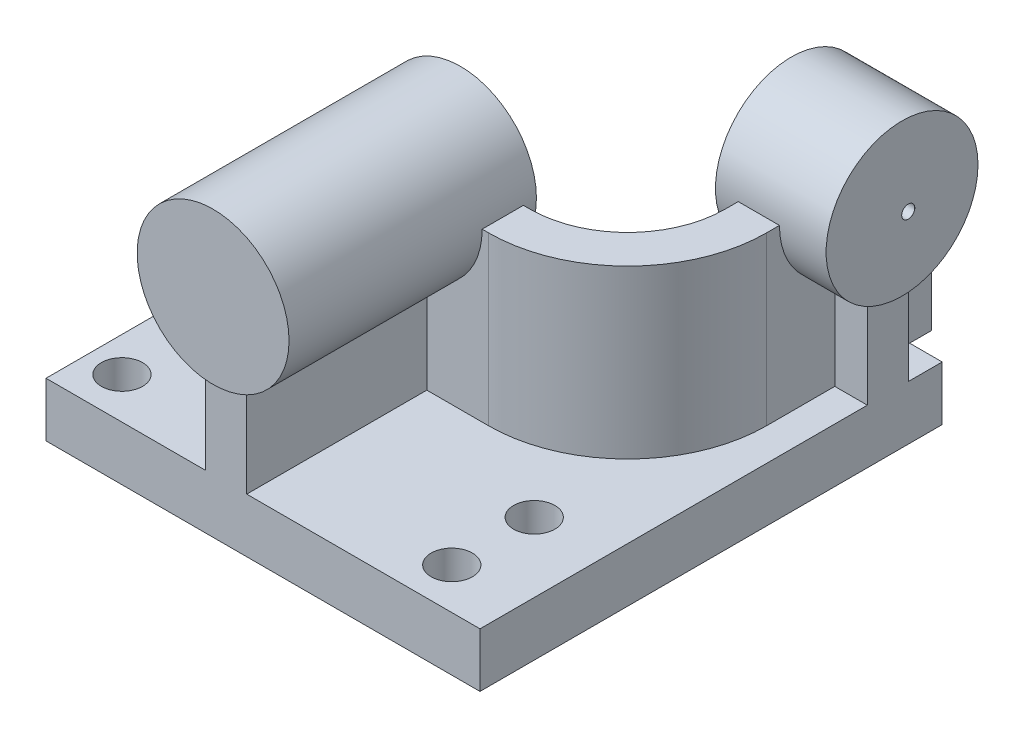
ISO-10303-21;
HEADER;
FILE_DESCRIPTION(('STEP AP214'),'2;1');
FILE_NAME('part.step','',(''),(''),'','','');
FILE_SCHEMA(('AUTOMOTIVE_DESIGN { 1 0 10303 214 1 1 1 1 }'));
ENDSEC;
DATA;
#1=APPLICATION_CONTEXT('core data for automotive mechanical design processes');
#2=APPLICATION_PROTOCOL_DEFINITION('international standard','automotive_design',2000,#1);
#3=PRODUCT_CONTEXT('',#1,'mechanical');
#4=PRODUCT('Part','Part','',(#3));
#5=PRODUCT_RELATED_PRODUCT_CATEGORY('part','',(#4));
#6=PRODUCT_DEFINITION_FORMATION('','',#4);
#7=PRODUCT_DEFINITION_CONTEXT('part definition',#1,'design');
#8=PRODUCT_DEFINITION('design','',#6,#7);
#9=PRODUCT_DEFINITION_SHAPE('','',#8);
#10=(LENGTH_UNIT() NAMED_UNIT(*) SI_UNIT(.MILLI.,.METRE.));
#11=(NAMED_UNIT(*) PLANE_ANGLE_UNIT() SI_UNIT($,.RADIAN.));
#12=(NAMED_UNIT(*) SI_UNIT($,.STERADIAN.) SOLID_ANGLE_UNIT());
#13=UNCERTAINTY_MEASURE_WITH_UNIT(LENGTH_MEASURE(1.E-05),#10,'distance_accuracy_value','');
#14=(GEOMETRIC_REPRESENTATION_CONTEXT(3) GLOBAL_UNCERTAINTY_ASSIGNED_CONTEXT((#13)) GLOBAL_UNIT_ASSIGNED_CONTEXT((#10,
#11,#12)) REPRESENTATION_CONTEXT('',''));
#15=CARTESIAN_POINT('',(0.,0.,0.));
#16=DIRECTION('',(0.,0.,1.));
#17=DIRECTION('',(1.,0.,0.));
#18=AXIS2_PLACEMENT_3D('',#15,#16,#17);
#19=CARTESIAN_POINT('',(121.,25.,-147.));
#20=DIRECTION('',(0.,-1.,0.));
#21=DIRECTION('',(0.,0.,-1.));
#22=AXIS2_PLACEMENT_3D('',#19,#20,#21);
#23=PLANE('',#22);
#24=CARTESIAN_POINT('',(16.,25.,-19.));
#25=DIRECTION('',(0.,1.,0.));
#26=DIRECTION('',(0.,0.,1.));
#27=AXIS2_PLACEMENT_3D('',#24,#25,#26);
#28=CIRCLE('',#27,9.5);
#29=CARTESIAN_POINT('',(16.,25.,-9.50000000000004));
#30=VERTEX_POINT('',#29);
#31=EDGE_CURVE('E334',#30,#30,#28,.T.);
#32=ORIENTED_EDGE('',*,*,#31,.F.);
#33=EDGE_LOOP('',(#32));
#34=FACE_BOUND('',#33,.T.);
#35=CARTESIAN_POINT('',(16.,25.,-57.));
#36=DIRECTION('',(0.,1.,0.));
#37=DIRECTION('',(0.,0.,1.));
#38=AXIS2_PLACEMENT_3D('',#35,#36,#37);
#39=CIRCLE('',#38,9.50000000000001);
#40=CARTESIAN_POINT('',(16.,25.,-47.5));
#41=VERTEX_POINT('',#40);
#42=EDGE_CURVE('E340',#41,#41,#39,.T.);
#43=ORIENTED_EDGE('',*,*,#42,.F.);
#44=EDGE_LOOP('',(#43));
#45=FACE_BOUND('',#44,.T.);
#46=DIRECTION('',(0.,0.,1.));
#47=VECTOR('',#46,1.);
#48=CARTESIAN_POINT('',(73.5,25.,-147.));
#49=LINE('',#48,#47);
#50=CARTESIAN_POINT('',(73.5,25.,-83.));
#51=VERTEX_POINT('',#50);
#52=CARTESIAN_POINT('',(73.5,25.,0.));
#53=VERTEX_POINT('',#52);
#54=EDGE_CURVE('E223',#51,#53,#49,.T.);
#55=ORIENTED_EDGE('',*,*,#54,.F.);
#56=DIRECTION('',(1.,0.,0.));
#57=VECTOR('',#56,1.);
#58=CARTESIAN_POINT('',(121.,25.,-83.));
#59=LINE('',#58,#57);
#60=CARTESIAN_POINT('',(48.,25.,-83.));
#61=VERTEX_POINT('',#60);
#62=EDGE_CURVE('E199',#61,#51,#59,.T.);
#63=ORIENTED_EDGE('',*,*,#62,.F.);
#64=DIRECTION('',(0.,0.,1.));
#65=VECTOR('',#64,1.);
#66=CARTESIAN_POINT('',(48.,25.,-102.));
#67=LINE('',#66,#65);
#68=CARTESIAN_POINT('',(48.,25.,-102.));
#69=VERTEX_POINT('',#68);
#70=EDGE_CURVE('E267',#69,#61,#67,.T.);
#71=ORIENTED_EDGE('',*,*,#70,.F.);
#72=DIRECTION('',(-1.,0.,0.));
#73=VECTOR('',#72,1.);
#74=CARTESIAN_POINT('',(121.,25.,-102.));
#75=LINE('',#74,#73);
#76=CARTESIAN_POINT('',(0.,25.,-102.));
#77=VERTEX_POINT('',#76);
#78=EDGE_CURVE('E346',#69,#77,#75,.T.);
#79=ORIENTED_EDGE('',*,*,#78,.T.);
#80=DIRECTION('',(0.,0.,1.));
#81=VECTOR('',#80,1.);
#82=CARTESIAN_POINT('',(0.,25.,-102.));
#83=LINE('',#82,#81);
#84=CARTESIAN_POINT('',(0.,25.,0.));
#85=VERTEX_POINT('',#84);
#86=EDGE_CURVE('E348',#77,#85,#83,.T.);
#87=ORIENTED_EDGE('',*,*,#86,.T.);
#88=DIRECTION('',(1.,0.,0.));
#89=VECTOR('',#88,1.);
#90=CARTESIAN_POINT('',(0.,25.,0.));
#91=LINE('',#90,#89);
#92=EDGE_CURVE('E352',#85,#53,#91,.T.);
#93=ORIENTED_EDGE('',*,*,#92,.T.);
#94=EDGE_LOOP('',(#55,#63,#71,#79,#87,#93));
#95=FACE_BOUND('',#94,.T.);
#96=ADVANCED_FACE('F33',(#34,#45,#95),#23,.F.);
#97=CARTESIAN_POINT('',(121.,102.,-83.));
#98=DIRECTION('',(0.,0.,-1.));
#99=DIRECTION('',(-1.,0.,0.));
#100=AXIS2_PLACEMENT_3D('',#97,#98,#99);
#101=PLANE('',#100);
#102=CARTESIAN_POINT('',(83.,102.,-83.));
#103=DIRECTION('',(0.,0.,-1.));
#104=DIRECTION('',(-1.,0.,0.));
#105=AXIS2_PLACEMENT_3D('',#102,#103,#104);
#106=CIRCLE('',#105,35.);
#107=CARTESIAN_POINT('',(118.,102.,-83.));
#108=VERTEX_POINT('',#107);
#109=CARTESIAN_POINT('',(92.5,68.313949474597,-83.));
#110=VERTEX_POINT('',#109);
#111=EDGE_CURVE('E216',#108,#110,#106,.T.);
#112=ORIENTED_EDGE('',*,*,#111,.T.);
#113=DIRECTION('',(0.,-1.,0.));
#114=VECTOR('',#113,1.);
#115=CARTESIAN_POINT('',(92.5,102.,-83.));
#116=LINE('',#115,#114);
#117=CARTESIAN_POINT('',(92.5,25.,-83.));
#118=VERTEX_POINT('',#117);
#119=EDGE_CURVE('E11',#110,#118,#116,.T.);
#120=ORIENTED_EDGE('',*,*,#119,.T.);
#121=CARTESIAN_POINT('',(121.,25.,-83.));
#122=VERTEX_POINT('',#121);
#123=EDGE_CURVE('E291',#118,#122,#59,.T.);
#124=ORIENTED_EDGE('',*,*,#123,.T.);
#125=DIRECTION('',(0.,-1.,0.));
#126=VECTOR('',#125,1.);
#127=CARTESIAN_POINT('',(121.,102.,-83.));
#128=LINE('',#127,#126);
#129=CARTESIAN_POINT('',(121.,102.,-83.));
#130=VERTEX_POINT('',#129);
#131=EDGE_CURVE('E313',#130,#122,#128,.T.);
#132=ORIENTED_EDGE('',*,*,#131,.F.);
#133=DIRECTION('',(1.,0.,0.));
#134=VECTOR('',#133,1.);
#135=CARTESIAN_POINT('',(121.,102.,-83.));
#136=LINE('',#135,#134);
#137=EDGE_CURVE('E276',#108,#130,#136,.T.);
#138=ORIENTED_EDGE('',*,*,#137,.F.);
#139=EDGE_LOOP('',(#112,#120,#124,#132,#138));
#140=FACE_BOUND('',#139,.T.);
#141=ADVANCED_FACE('F413',(#140),#101,.F.);
#142=CARTESIAN_POINT('',(168.,25.,-19.));
#143=DIRECTION('',(0.,1.,0.));
#144=DIRECTION('',(0.,0.,1.));
#145=AXIS2_PLACEMENT_3D('',#142,#143,#144);
#146=CIRCLE('',#145,9.49999999999998);
#147=CARTESIAN_POINT('',(168.,25.,-9.50000000000006));
#148=VERTEX_POINT('',#147);
#149=EDGE_CURVE('E328',#148,#148,#146,.T.);
#150=ORIENTED_EDGE('',*,*,#149,.F.);
#151=EDGE_LOOP('',(#150));
#152=FACE_BOUND('',#151,.T.);
#153=CARTESIAN_POINT('',(168.,25.,-57.));
#154=DIRECTION('',(0.,1.,0.));
#155=DIRECTION('',(0.,0.,1.));
#156=AXIS2_PLACEMENT_3D('',#153,#154,#155);
#157=CIRCLE('',#156,9.50000000000001);
#158=CARTESIAN_POINT('',(168.,25.,-47.5));
#159=VERTEX_POINT('',#158);
#160=EDGE_CURVE('E322',#159,#159,#157,.T.);
#161=ORIENTED_EDGE('',*,*,#160,.F.);
#162=EDGE_LOOP('',(#161));
#163=FACE_BOUND('',#162,.T.);
#164=ORIENTED_EDGE('',*,*,#123,.F.);
#165=DIRECTION('',(0.,0.,1.));
#166=VECTOR('',#165,1.);
#167=CARTESIAN_POINT('',(92.5,25.,-147.));
#168=LINE('',#167,#166);
#169=CARTESIAN_POINT('',(92.5,25.,0.));
#170=VERTEX_POINT('',#169);
#171=EDGE_CURVE('E229',#118,#170,#168,.T.);
#172=ORIENTED_EDGE('',*,*,#171,.T.);
#173=CARTESIAN_POINT('',(200.,25.,0.));
#174=VERTEX_POINT('',#173);
#175=EDGE_CURVE('E351',#170,#174,#91,.T.);
#176=ORIENTED_EDGE('',*,*,#175,.T.);
#177=DIRECTION('',(0.,0.,-1.));
#178=VECTOR('',#177,1.);
#179=CARTESIAN_POINT('',(200.,25.,0.));
#180=LINE('',#179,#178);
#181=CARTESIAN_POINT('',(200.,25.,-178.5));
#182=VERTEX_POINT('',#181);
#183=EDGE_CURVE('E355',#174,#182,#180,.T.);
#184=ORIENTED_EDGE('',*,*,#183,.T.);
#185=DIRECTION('',(1.,0.,0.));
#186=VECTOR('',#185,1.);
#187=CARTESIAN_POINT('',(121.,25.,-178.5));
#188=LINE('',#187,#186);
#189=CARTESIAN_POINT('',(185.,25.,-178.5));
#190=VERTEX_POINT('',#189);
#191=EDGE_CURVE('E241',#190,#182,#188,.T.);
#192=ORIENTED_EDGE('',*,*,#191,.F.);
#193=DIRECTION('',(0.,0.,-1.));
#194=VECTOR('',#193,1.);
#195=CARTESIAN_POINT('',(185.,25.,-223.));
#196=LINE('',#195,#194);
#197=CARTESIAN_POINT('',(185.,25.,-147.));
#198=VERTEX_POINT('',#197);
#199=EDGE_CURVE('E297',#198,#190,#196,.T.);
#200=ORIENTED_EDGE('',*,*,#199,.F.);
#201=CARTESIAN_POINT('',(121.,25.,-147.));
#202=DIRECTION('',(0.,1.,0.));
#203=DIRECTION('',(0.,0.,1.));
#204=AXIS2_PLACEMENT_3D('',#201,#202,#203);
#205=CIRCLE('',#204,64.);
#206=EDGE_CURVE('E293',#122,#198,#205,.T.);
#207=ORIENTED_EDGE('',*,*,#206,.F.);
#208=EDGE_LOOP('',(#164,#172,#176,#184,#192,#200,#207));
#209=FACE_BOUND('',#208,.T.);
#210=ADVANCED_FACE('F418',(#152,#163,#209),#23,.F.);
#211=CARTESIAN_POINT('',(185.,102.,-223.));
#212=DIRECTION('',(-1.,0.,0.));
#213=DIRECTION('',(0.,0.,1.));
#214=AXIS2_PLACEMENT_3D('',#211,#212,#213);
#215=PLANE('',#214);
#216=CARTESIAN_POINT('',(185.,102.,-188.));
#217=DIRECTION('',(-1.,0.,0.));
#218=DIRECTION('',(0.,0.,1.));
#219=AXIS2_PLACEMENT_3D('',#216,#217,#218);
#220=CIRCLE('',#219,35.);
#221=CARTESIAN_POINT('',(185.,102.,-223.));
#222=VERTEX_POINT('',#221);
#223=CARTESIAN_POINT('',(185.,68.313949474597,-197.5));
#224=VERTEX_POINT('',#223);
#225=EDGE_CURVE('E254',#222,#224,#220,.T.);
#226=ORIENTED_EDGE('',*,*,#225,.T.);
#227=DIRECTION('',(0.,-1.,0.));
#228=VECTOR('',#227,1.);
#229=CARTESIAN_POINT('',(185.,102.,-197.5));
#230=LINE('',#229,#228);
#231=CARTESIAN_POINT('',(185.,25.,-197.5));
#232=VERTEX_POINT('',#231);
#233=EDGE_CURVE('E401',#224,#232,#230,.T.);
#234=ORIENTED_EDGE('',*,*,#233,.T.);
#235=CARTESIAN_POINT('',(185.,25.,-213.));
#236=VERTEX_POINT('',#235);
#237=EDGE_CURVE('E301',#232,#236,#196,.T.);
#238=ORIENTED_EDGE('',*,*,#237,.T.);
#239=CARTESIAN_POINT('',(185.,25.,-223.));
#240=VERTEX_POINT('',#239);
#241=EDGE_CURVE('E296',#236,#240,#196,.T.);
#242=ORIENTED_EDGE('',*,*,#241,.T.);
#243=DIRECTION('',(0.,-1.,0.));
#244=VECTOR('',#243,1.);
#245=CARTESIAN_POINT('',(185.,102.,-223.));
#246=LINE('',#245,#244);
#247=EDGE_CURVE('E307',#222,#240,#246,.T.);
#248=ORIENTED_EDGE('',*,*,#247,.F.);
#249=EDGE_LOOP('',(#226,#234,#238,#242,#248));
#250=FACE_BOUND('',#249,.T.);
#251=ADVANCED_FACE('F466',(#250),#215,.F.);
#252=ORIENTED_EDGE('',*,*,#237,.F.);
#253=DIRECTION('',(1.,0.,0.));
#254=VECTOR('',#253,1.);
#255=CARTESIAN_POINT('',(121.,25.,-197.5));
#256=LINE('',#255,#254);
#257=CARTESIAN_POINT('',(200.,25.,-197.5));
#258=VERTEX_POINT('',#257);
#259=EDGE_CURVE('E244',#232,#258,#256,.T.);
#260=ORIENTED_EDGE('',*,*,#259,.T.);
#261=CARTESIAN_POINT('',(200.,25.,-213.));
#262=VERTEX_POINT('',#261);
#263=EDGE_CURVE('E354',#258,#262,#180,.T.);
#264=ORIENTED_EDGE('',*,*,#263,.T.);
#265=DIRECTION('',(-1.,0.,0.));
#266=VECTOR('',#265,1.);
#267=CARTESIAN_POINT('',(200.,25.,-213.));
#268=LINE('',#267,#266);
#269=EDGE_CURVE('E359',#262,#236,#268,.T.);
#270=ORIENTED_EDGE('',*,*,#269,.T.);
#271=EDGE_LOOP('',(#252,#260,#264,#270));
#272=FACE_BOUND('',#271,.T.);
#273=ADVANCED_FACE('F459',(#272),#23,.F.);
#274=CARTESIAN_POINT('',(121.,0.,-147.));
#275=DIRECTION('',(0.,-1.,0.));
#276=DIRECTION('',(0.,0.,-1.));
#277=AXIS2_PLACEMENT_3D('',#274,#275,#276);
#278=PLANE('',#277);
#279=DIRECTION('',(0.,0.,-1.));
#280=VECTOR('',#279,1.);
#281=CARTESIAN_POINT('',(200.,0.,0.));
#282=LINE('',#281,#280);
#283=CARTESIAN_POINT('',(200.,0.,0.));
#284=VERTEX_POINT('',#283);
#285=CARTESIAN_POINT('',(200.,0.,-213.));
#286=VERTEX_POINT('',#285);
#287=EDGE_CURVE('E368',#284,#286,#282,.T.);
#288=ORIENTED_EDGE('',*,*,#287,.F.);
#289=DIRECTION('',(1.,0.,0.));
#290=VECTOR('',#289,1.);
#291=CARTESIAN_POINT('',(0.,0.,0.));
#292=LINE('',#291,#290);
#293=CARTESIAN_POINT('',(0.,0.,0.));
#294=VERTEX_POINT('',#293);
#295=EDGE_CURVE('E366',#294,#284,#292,.T.);
#296=ORIENTED_EDGE('',*,*,#295,.F.);
#297=DIRECTION('',(0.,0.,1.));
#298=VECTOR('',#297,1.);
#299=CARTESIAN_POINT('',(0.,0.,-102.));
#300=LINE('',#299,#298);
#301=CARTESIAN_POINT('',(0.,0.,-102.));
#302=VERTEX_POINT('',#301);
#303=EDGE_CURVE('E364',#302,#294,#300,.T.);
#304=ORIENTED_EDGE('',*,*,#303,.F.);
#305=DIRECTION('',(-1.,0.,0.));
#306=VECTOR('',#305,1.);
#307=CARTESIAN_POINT('',(121.,0.,-102.));
#308=LINE('',#307,#306);
#309=CARTESIAN_POINT('',(121.,0.,-102.));
#310=VERTEX_POINT('',#309);
#311=EDGE_CURVE('E343',#310,#302,#308,.T.);
#312=ORIENTED_EDGE('',*,*,#311,.F.);
#313=CARTESIAN_POINT('',(121.,0.,-147.));
#314=DIRECTION('',(0.,-1.,0.));
#315=DIRECTION('',(0.,0.,-1.));
#316=AXIS2_PLACEMENT_3D('',#313,#314,#315);
#317=CIRCLE('',#316,45.);
#318=CARTESIAN_POINT('',(166.,0.,-147.));
#319=VERTEX_POINT('',#318);
#320=EDGE_CURVE('E349',#319,#310,#317,.T.);
#321=ORIENTED_EDGE('',*,*,#320,.F.);
#322=DIRECTION('',(0.,0.,1.));
#323=VECTOR('',#322,1.);
#324=CARTESIAN_POINT('',(166.,0.,-213.));
#325=LINE('',#324,#323);
#326=CARTESIAN_POINT('',(166.,0.,-213.));
#327=VERTEX_POINT('',#326);
#328=EDGE_CURVE('E372',#327,#319,#325,.T.);
#329=ORIENTED_EDGE('',*,*,#328,.F.);
#330=DIRECTION('',(-1.,0.,0.));
#331=VECTOR('',#330,1.);
#332=CARTESIAN_POINT('',(200.,0.,-213.));
#333=LINE('',#332,#331);
#334=EDGE_CURVE('E370',#286,#327,#333,.T.);
#335=ORIENTED_EDGE('',*,*,#334,.F.);
#336=EDGE_LOOP('',(#288,#296,#304,#312,#321,#329,#335));
#337=FACE_BOUND('',#336,.T.);
#338=CARTESIAN_POINT('',(168.,0.,-19.));
#339=DIRECTION('',(0.,1.,0.));
#340=DIRECTION('',(0.,0.,1.));
#341=AXIS2_PLACEMENT_3D('',#338,#339,#340);
#342=CIRCLE('',#341,9.49999999999998);
#343=CARTESIAN_POINT('',(168.,0.,-9.50000000000006));
#344=VERTEX_POINT('',#343);
#345=EDGE_CURVE('E325',#344,#344,#342,.T.);
#346=ORIENTED_EDGE('',*,*,#345,.T.);
#347=EDGE_LOOP('',(#346));
#348=FACE_BOUND('',#347,.T.);
#349=CARTESIAN_POINT('',(168.,0.,-57.));
#350=DIRECTION('',(0.,1.,0.));
#351=DIRECTION('',(0.,0.,1.));
#352=AXIS2_PLACEMENT_3D('',#349,#350,#351);
#353=CIRCLE('',#352,9.50000000000001);
#354=CARTESIAN_POINT('',(168.,0.,-47.5));
#355=VERTEX_POINT('',#354);
#356=EDGE_CURVE('E321',#355,#355,#353,.T.);
#357=ORIENTED_EDGE('',*,*,#356,.T.);
#358=EDGE_LOOP('',(#357));
#359=FACE_BOUND('',#358,.T.);
#360=CARTESIAN_POINT('',(16.,0.,-19.));
#361=DIRECTION('',(0.,1.,0.));
#362=DIRECTION('',(0.,0.,1.));
#363=AXIS2_PLACEMENT_3D('',#360,#361,#362);
#364=CIRCLE('',#363,9.5);
#365=CARTESIAN_POINT('',(16.,0.,-9.50000000000004));
#366=VERTEX_POINT('',#365);
#367=EDGE_CURVE('E331',#366,#366,#364,.T.);
#368=ORIENTED_EDGE('',*,*,#367,.T.);
#369=EDGE_LOOP('',(#368));
#370=FACE_BOUND('',#369,.T.);
#371=CARTESIAN_POINT('',(16.,0.,-57.));
#372=DIRECTION('',(0.,1.,0.));
#373=DIRECTION('',(0.,0.,1.));
#374=AXIS2_PLACEMENT_3D('',#371,#372,#373);
#375=CIRCLE('',#374,9.50000000000001);
#376=CARTESIAN_POINT('',(16.,0.,-47.5));
#377=VERTEX_POINT('',#376);
#378=EDGE_CURVE('E337',#377,#377,#375,.T.);
#379=ORIENTED_EDGE('',*,*,#378,.T.);
#380=EDGE_LOOP('',(#379));
#381=FACE_BOUND('',#380,.T.);
#382=ADVANCED_FACE('F442',(#337,#348,#359,#370,#381),#278,.T.);
#383=CARTESIAN_POINT('',(121.,25.,-102.));
#384=DIRECTION('',(0.,0.,1.));
#385=DIRECTION('',(1.,0.,0.));
#386=AXIS2_PLACEMENT_3D('',#383,#384,#385);
#387=PLANE('',#386);
#388=CARTESIAN_POINT('',(83.,102.,-102.));
#389=DIRECTION('',(0.,0.,1.));
#390=DIRECTION('',(1.,0.,0.));
#391=AXIS2_PLACEMENT_3D('',#388,#389,#390);
#392=CIRCLE('',#391,35.);
#393=CARTESIAN_POINT('',(48.,102.,-102.));
#394=VERTEX_POINT('',#393);
#395=CARTESIAN_POINT('',(118.,102.,-102.));
#396=VERTEX_POINT('',#395);
#397=EDGE_CURVE('E265',#394,#396,#392,.T.);
#398=ORIENTED_EDGE('',*,*,#397,.T.);
#399=DIRECTION('',(-1.,0.,0.));
#400=VECTOR('',#399,1.);
#401=CARTESIAN_POINT('',(121.,102.,-102.));
#402=LINE('',#401,#400);
#403=CARTESIAN_POINT('',(121.,102.,-102.));
#404=VERTEX_POINT('',#403);
#405=EDGE_CURVE('E271',#404,#396,#402,.T.);
#406=ORIENTED_EDGE('',*,*,#405,.F.);
#407=DIRECTION('',(0.,-1.,0.));
#408=VECTOR('',#407,1.);
#409=CARTESIAN_POINT('',(121.,25.,-102.));
#410=LINE('',#409,#408);
#411=EDGE_CURVE('E362',#404,#310,#410,.T.);
#412=ORIENTED_EDGE('',*,*,#411,.T.);
#413=ORIENTED_EDGE('',*,*,#311,.T.);
#414=DIRECTION('',(0.,-1.,0.));
#415=VECTOR('',#414,1.);
#416=CARTESIAN_POINT('',(0.,25.,-102.));
#417=LINE('',#416,#415);
#418=EDGE_CURVE('E392',#77,#302,#417,.T.);
#419=ORIENTED_EDGE('',*,*,#418,.F.);
#420=ORIENTED_EDGE('',*,*,#78,.F.);
#421=DIRECTION('',(0.,-1.,0.));
#422=VECTOR('',#421,1.);
#423=CARTESIAN_POINT('',(48.,102.,-102.));
#424=LINE('',#423,#422);
#425=EDGE_CURVE('E318',#394,#69,#424,.T.);
#426=ORIENTED_EDGE('',*,*,#425,.F.);
#427=EDGE_LOOP('',(#398,#406,#412,#413,#419,#420,#426));
#428=FACE_BOUND('',#427,.T.);
#429=ADVANCED_FACE('F35',(#428),#387,.F.);
#430=CARTESIAN_POINT('',(0.,25.,-102.));
#431=DIRECTION('',(1.,0.,0.));
#432=DIRECTION('',(0.,0.,-1.));
#433=AXIS2_PLACEMENT_3D('',#430,#431,#432);
#434=PLANE('',#433);
#435=ORIENTED_EDGE('',*,*,#303,.T.);
#436=DIRECTION('',(0.,-1.,0.));
#437=VECTOR('',#436,1.);
#438=CARTESIAN_POINT('',(0.,25.,0.));
#439=LINE('',#438,#437);
#440=EDGE_CURVE('E389',#85,#294,#439,.T.);
#441=ORIENTED_EDGE('',*,*,#440,.F.);
#442=ORIENTED_EDGE('',*,*,#86,.F.);
#443=ORIENTED_EDGE('',*,*,#418,.T.);
#444=EDGE_LOOP('',(#435,#441,#442,#443));
#445=FACE_BOUND('',#444,.T.);
#446=ADVANCED_FACE('F491',(#445),#434,.F.);
#447=CARTESIAN_POINT('',(0.,25.,0.));
#448=DIRECTION('',(0.,0.,-1.));
#449=DIRECTION('',(-1.,0.,0.));
#450=AXIS2_PLACEMENT_3D('',#447,#448,#449);
#451=PLANE('',#450);
#452=ORIENTED_EDGE('',*,*,#175,.F.);
#453=DIRECTION('',(0.,1.,0.));
#454=VECTOR('',#453,1.);
#455=CARTESIAN_POINT('',(92.5,58.152416816945,0.));
#456=LINE('',#455,#454);
#457=CARTESIAN_POINT('',(92.5,68.313949474597,0.));
#458=VERTEX_POINT('',#457);
#459=EDGE_CURVE('E50',#458,#170,#456,.F.);
#460=ORIENTED_EDGE('',*,*,#459,.F.);
#461=CARTESIAN_POINT('',(83.,102.,0.));
#462=DIRECTION('',(0.,0.,1.));
#463=DIRECTION('',(1.,0.,0.));
#464=AXIS2_PLACEMENT_3D('',#461,#462,#463);
#465=CIRCLE('',#464,35.);
#466=CARTESIAN_POINT('',(73.5,68.313949474597,0.));
#467=VERTEX_POINT('',#466);
#468=EDGE_CURVE('E203',#458,#467,#465,.F.);
#469=ORIENTED_EDGE('',*,*,#468,.T.);
#470=DIRECTION('',(0.,1.,0.));
#471=VECTOR('',#470,1.);
#472=CARTESIAN_POINT('',(73.5,58.152416816945,0.));
#473=LINE('',#472,#471);
#474=EDGE_CURVE('E58',#467,#53,#473,.F.);
#475=ORIENTED_EDGE('',*,*,#474,.T.);
#476=ORIENTED_EDGE('',*,*,#92,.F.);
#477=ORIENTED_EDGE('',*,*,#440,.T.);
#478=ORIENTED_EDGE('',*,*,#295,.T.);
#479=DIRECTION('',(0.,-1.,0.));
#480=VECTOR('',#479,1.);
#481=CARTESIAN_POINT('',(200.,25.,0.));
#482=LINE('',#481,#480);
#483=EDGE_CURVE('E386',#174,#284,#482,.T.);
#484=ORIENTED_EDGE('',*,*,#483,.F.);
#485=EDGE_LOOP('',(#452,#460,#469,#475,#476,#477,#478,#484));
#486=FACE_BOUND('',#485,.T.);
#487=ADVANCED_FACE('F408',(#486),#451,.F.);
#488=CARTESIAN_POINT('',(200.,25.,0.));
#489=DIRECTION('',(-1.,0.,0.));
#490=DIRECTION('',(0.,0.,1.));
#491=AXIS2_PLACEMENT_3D('',#488,#489,#490);
#492=PLANE('',#491);
#493=ORIENTED_EDGE('',*,*,#263,.F.);
#494=DIRECTION('',(0.,1.,0.));
#495=VECTOR('',#494,1.);
#496=CARTESIAN_POINT('',(200.,59.7394826747226,-197.5));
#497=LINE('',#496,#495);
#498=CARTESIAN_POINT('',(200.,68.313949474597,-197.5));
#499=VERTEX_POINT('',#498);
#500=EDGE_CURVE('E232',#499,#258,#497,.F.);
#501=ORIENTED_EDGE('',*,*,#500,.F.);
#502=CARTESIAN_POINT('',(200.,102.,-188.));
#503=DIRECTION('',(1.,0.,0.));
#504=DIRECTION('',(0.,0.,-1.));
#505=AXIS2_PLACEMENT_3D('',#502,#503,#504);
#506=CIRCLE('',#505,35.);
#507=CARTESIAN_POINT('',(200.,68.313949474597,-178.5));
#508=VERTEX_POINT('',#507);
#509=EDGE_CURVE('E400',#499,#508,#506,.F.);
#510=ORIENTED_EDGE('',*,*,#509,.T.);
#511=DIRECTION('',(0.,1.,0.));
#512=VECTOR('',#511,1.);
#513=CARTESIAN_POINT('',(200.,59.7394826747226,-178.5));
#514=LINE('',#513,#512);
#515=EDGE_CURVE('E231',#508,#182,#514,.F.);
#516=ORIENTED_EDGE('',*,*,#515,.T.);
#517=ORIENTED_EDGE('',*,*,#183,.F.);
#518=ORIENTED_EDGE('',*,*,#483,.T.);
#519=ORIENTED_EDGE('',*,*,#287,.T.);
#520=DIRECTION('',(0.,-1.,0.));
#521=VECTOR('',#520,1.);
#522=CARTESIAN_POINT('',(200.,25.,-213.));
#523=LINE('',#522,#521);
#524=EDGE_CURVE('E383',#262,#286,#523,.T.);
#525=ORIENTED_EDGE('',*,*,#524,.F.);
#526=EDGE_LOOP('',(#493,#501,#510,#516,#517,#518,#519,#525));
#527=FACE_BOUND('',#526,.T.);
#528=ADVANCED_FACE('F449',(#527),#492,.F.);
#529=CARTESIAN_POINT('',(200.,25.,-213.));
#530=DIRECTION('',(0.,0.,1.));
#531=DIRECTION('',(1.,0.,0.));
#532=AXIS2_PLACEMENT_3D('',#529,#530,#531);
#533=PLANE('',#532);
#534=ORIENTED_EDGE('',*,*,#334,.T.);
#535=DIRECTION('',(0.,-1.,0.));
#536=VECTOR('',#535,1.);
#537=CARTESIAN_POINT('',(166.,25.,-213.));
#538=LINE('',#537,#536);
#539=CARTESIAN_POINT('',(166.,25.,-213.));
#540=VERTEX_POINT('',#539);
#541=EDGE_CURVE('E380',#540,#327,#538,.T.);
#542=ORIENTED_EDGE('',*,*,#541,.F.);
#543=EDGE_CURVE('E358',#236,#540,#268,.T.);
#544=ORIENTED_EDGE('',*,*,#543,.F.);
#545=ORIENTED_EDGE('',*,*,#269,.F.);
#546=ORIENTED_EDGE('',*,*,#524,.T.);
#547=EDGE_LOOP('',(#534,#542,#544,#545,#546));
#548=FACE_BOUND('',#547,.T.);
#549=ADVANCED_FACE('F453',(#548),#533,.F.);
#550=CARTESIAN_POINT('',(166.,25.,-213.));
#551=DIRECTION('',(1.,0.,0.));
#552=DIRECTION('',(0.,0.,-1.));
#553=AXIS2_PLACEMENT_3D('',#550,#551,#552);
#554=PLANE('',#553);
#555=CARTESIAN_POINT('',(166.,102.,-188.));
#556=DIRECTION('',(1.,0.,0.));
#557=DIRECTION('',(0.,0.,-1.));
#558=AXIS2_PLACEMENT_3D('',#555,#556,#557);
#559=CIRCLE('',#558,35.);
#560=CARTESIAN_POINT('',(166.,102.,-153.));
#561=VERTEX_POINT('',#560);
#562=CARTESIAN_POINT('',(166.,102.,-223.));
#563=VERTEX_POINT('',#562);
#564=EDGE_CURVE('E257',#561,#563,#559,.T.);
#565=ORIENTED_EDGE('',*,*,#564,.T.);
#566=DIRECTION('',(0.,-1.,0.));
#567=VECTOR('',#566,1.);
#568=CARTESIAN_POINT('',(166.,102.,-223.));
#569=LINE('',#568,#567);
#570=CARTESIAN_POINT('',(166.,25.,-223.));
#571=VERTEX_POINT('',#570);
#572=EDGE_CURVE('E288',#563,#571,#569,.T.);
#573=ORIENTED_EDGE('',*,*,#572,.T.);
#574=DIRECTION('',(0.,0.,1.));
#575=VECTOR('',#574,1.);
#576=CARTESIAN_POINT('',(166.,25.,-223.));
#577=LINE('',#576,#575);
#578=EDGE_CURVE('E272',#571,#540,#577,.T.);
#579=ORIENTED_EDGE('',*,*,#578,.T.);
#580=ORIENTED_EDGE('',*,*,#541,.T.);
#581=ORIENTED_EDGE('',*,*,#328,.T.);
#582=DIRECTION('',(0.,-1.,0.));
#583=VECTOR('',#582,1.);
#584=CARTESIAN_POINT('',(166.,25.,-147.));
#585=LINE('',#584,#583);
#586=CARTESIAN_POINT('',(166.,102.,-147.));
#587=VERTEX_POINT('',#586);
#588=EDGE_CURVE('E377',#587,#319,#585,.T.);
#589=ORIENTED_EDGE('',*,*,#588,.F.);
#590=DIRECTION('',(0.,0.,1.));
#591=VECTOR('',#590,1.);
#592=CARTESIAN_POINT('',(166.,102.,-223.));
#593=LINE('',#592,#591);
#594=EDGE_CURVE('E286',#561,#587,#593,.T.);
#595=ORIENTED_EDGE('',*,*,#594,.F.);
#596=EDGE_LOOP('',(#565,#573,#579,#580,#581,#589,#595));
#597=FACE_BOUND('',#596,.T.);
#598=ADVANCED_FACE('F486',(#597),#554,.F.);
#599=CARTESIAN_POINT('',(121.,25.,-147.));
#600=DIRECTION('',(0.,-1.,0.));
#601=DIRECTION('',(0.,0.,-1.));
#602=AXIS2_PLACEMENT_3D('',#599,#600,#601);
#603=CYLINDRICAL_SURFACE('',#602,45.);
#604=ORIENTED_EDGE('',*,*,#320,.T.);
#605=ORIENTED_EDGE('',*,*,#411,.F.);
#606=CARTESIAN_POINT('',(121.,102.,-147.));
#607=DIRECTION('',(0.,-1.,0.));
#608=DIRECTION('',(0.,0.,1.));
#609=AXIS2_PLACEMENT_3D('',#606,#607,#608);
#610=CIRCLE('',#609,45.);
#611=EDGE_CURVE('E268',#587,#404,#610,.T.);
#612=ORIENTED_EDGE('',*,*,#611,.F.);
#613=ORIENTED_EDGE('',*,*,#588,.T.);
#614=EDGE_LOOP('',(#604,#605,#612,#613));
#615=FACE_BOUND('',#614,.T.);
#616=ADVANCED_FACE('F490',(#615),#603,.F.);
#617=CARTESIAN_POINT('',(16.,25.,-57.));
#618=DIRECTION('',(0.,-1.,0.));
#619=DIRECTION('',(0.,0.,-1.));
#620=AXIS2_PLACEMENT_3D('',#617,#618,#619);
#621=CYLINDRICAL_SURFACE('',#620,9.50000000000001);
#622=ORIENTED_EDGE('',*,*,#42,.T.);
#623=EDGE_LOOP('',(#622));
#624=FACE_BOUND('',#623,.T.);
#625=ORIENTED_EDGE('',*,*,#378,.F.);
#626=EDGE_LOOP('',(#625));
#627=FACE_BOUND('',#626,.T.);
#628=ADVANCED_FACE('F544',(#624,#627),#621,.F.);
#629=CARTESIAN_POINT('',(16.,25.,-19.));
#630=DIRECTION('',(0.,-1.,0.));
#631=DIRECTION('',(0.,0.,-1.));
#632=AXIS2_PLACEMENT_3D('',#629,#630,#631);
#633=CYLINDRICAL_SURFACE('',#632,9.5);
#634=ORIENTED_EDGE('',*,*,#31,.T.);
#635=EDGE_LOOP('',(#634));
#636=FACE_BOUND('',#635,.T.);
#637=ORIENTED_EDGE('',*,*,#367,.F.);
#638=EDGE_LOOP('',(#637));
#639=FACE_BOUND('',#638,.T.);
#640=ADVANCED_FACE('F541',(#636,#639),#633,.F.);
#641=CARTESIAN_POINT('',(168.,25.,-19.));
#642=DIRECTION('',(0.,-1.,0.));
#643=DIRECTION('',(0.,0.,-1.));
#644=AXIS2_PLACEMENT_3D('',#641,#642,#643);
#645=CYLINDRICAL_SURFACE('',#644,9.49999999999998);
#646=ORIENTED_EDGE('',*,*,#149,.T.);
#647=EDGE_LOOP('',(#646));
#648=FACE_BOUND('',#647,.T.);
#649=ORIENTED_EDGE('',*,*,#345,.F.);
#650=EDGE_LOOP('',(#649));
#651=FACE_BOUND('',#650,.T.);
#652=ADVANCED_FACE('F537',(#648,#651),#645,.F.);
#653=CARTESIAN_POINT('',(168.,25.,-57.));
#654=DIRECTION('',(0.,-1.,0.));
#655=DIRECTION('',(0.,0.,-1.));
#656=AXIS2_PLACEMENT_3D('',#653,#654,#655);
#657=CYLINDRICAL_SURFACE('',#656,9.50000000000001);
#658=ORIENTED_EDGE('',*,*,#160,.T.);
#659=EDGE_LOOP('',(#658));
#660=FACE_BOUND('',#659,.T.);
#661=ORIENTED_EDGE('',*,*,#356,.F.);
#662=EDGE_LOOP('',(#661));
#663=FACE_BOUND('',#662,.T.);
#664=ADVANCED_FACE('F534',(#660,#663),#657,.F.);
#665=CARTESIAN_POINT('',(121.,25.,-147.));
#666=DIRECTION('',(0.,1.,0.));
#667=DIRECTION('',(0.,0.,1.));
#668=AXIS2_PLACEMENT_3D('',#665,#666,#667);
#669=PLANE('',#668);
#670=ORIENTED_EDGE('',*,*,#241,.F.);
#671=ORIENTED_EDGE('',*,*,#543,.T.);
#672=ORIENTED_EDGE('',*,*,#578,.F.);
#673=DIRECTION('',(-1.,0.,0.));
#674=VECTOR('',#673,1.);
#675=CARTESIAN_POINT('',(166.,25.,-223.));
#676=LINE('',#675,#674);
#677=EDGE_CURVE('E300',#240,#571,#676,.T.);
#678=ORIENTED_EDGE('',*,*,#677,.F.);
#679=EDGE_LOOP('',(#670,#671,#672,#678));
#680=FACE_BOUND('',#679,.T.);
#681=ADVANCED_FACE('F463',(#680),#669,.F.);
#682=CARTESIAN_POINT('',(48.,102.,-102.));
#683=DIRECTION('',(1.,0.,0.));
#684=DIRECTION('',(0.,0.,-1.));
#685=AXIS2_PLACEMENT_3D('',#682,#683,#684);
#686=PLANE('',#685);
#687=ORIENTED_EDGE('',*,*,#70,.T.);
#688=DIRECTION('',(0.,-1.,0.));
#689=VECTOR('',#688,1.);
#690=CARTESIAN_POINT('',(48.,102.,-83.));
#691=LINE('',#690,#689);
#692=CARTESIAN_POINT('',(48.,102.,-83.));
#693=VERTEX_POINT('',#692);
#694=EDGE_CURVE('E316',#693,#61,#691,.T.);
#695=ORIENTED_EDGE('',*,*,#694,.F.);
#696=DIRECTION('',(0.,0.,1.));
#697=VECTOR('',#696,1.);
#698=CARTESIAN_POINT('',(48.,102.,-102.));
#699=LINE('',#698,#697);
#700=EDGE_CURVE('E215',#394,#693,#699,.T.);
#701=ORIENTED_EDGE('',*,*,#700,.F.);
#702=ORIENTED_EDGE('',*,*,#425,.T.);
#703=EDGE_LOOP('',(#687,#695,#701,#702));
#704=FACE_BOUND('',#703,.T.);
#705=ADVANCED_FACE('F432',(#704),#686,.F.);
#706=DIRECTION('',(0.,-1.,0.));
#707=VECTOR('',#706,1.);
#708=CARTESIAN_POINT('',(73.5,102.,-83.));
#709=LINE('',#708,#707);
#710=CARTESIAN_POINT('',(73.5,68.313949474597,-83.));
#711=VERTEX_POINT('',#710);
#712=EDGE_CURVE('E42',#711,#51,#709,.T.);
#713=ORIENTED_EDGE('',*,*,#712,.F.);
#714=EDGE_CURVE('E197',#711,#693,#106,.T.);
#715=ORIENTED_EDGE('',*,*,#714,.T.);
#716=ORIENTED_EDGE('',*,*,#694,.T.);
#717=ORIENTED_EDGE('',*,*,#62,.T.);
#718=EDGE_LOOP('',(#713,#715,#716,#717));
#719=FACE_BOUND('',#718,.T.);
#720=ADVANCED_FACE('F195',(#719),#101,.F.);
#721=CARTESIAN_POINT('',(121.,102.,-147.));
#722=DIRECTION('',(0.,-1.,0.));
#723=DIRECTION('',(0.,0.,-1.));
#724=AXIS2_PLACEMENT_3D('',#721,#722,#723);
#725=CYLINDRICAL_SURFACE('',#724,64.);
#726=ORIENTED_EDGE('',*,*,#206,.T.);
#727=DIRECTION('',(0.,-1.,0.));
#728=VECTOR('',#727,1.);
#729=CARTESIAN_POINT('',(185.,102.,-147.));
#730=LINE('',#729,#728);
#731=CARTESIAN_POINT('',(185.,102.,-147.));
#732=VERTEX_POINT('',#731);
#733=EDGE_CURVE('E310',#732,#198,#730,.T.);
#734=ORIENTED_EDGE('',*,*,#733,.F.);
#735=CARTESIAN_POINT('',(121.,102.,-147.));
#736=DIRECTION('',(0.,1.,0.));
#737=DIRECTION('',(0.,0.,1.));
#738=AXIS2_PLACEMENT_3D('',#735,#736,#737);
#739=CIRCLE('',#738,64.);
#740=EDGE_CURVE('E278',#130,#732,#739,.T.);
#741=ORIENTED_EDGE('',*,*,#740,.F.);
#742=ORIENTED_EDGE('',*,*,#131,.T.);
#743=EDGE_LOOP('',(#726,#734,#741,#742));
#744=FACE_BOUND('',#743,.T.);
#745=ADVANCED_FACE('F422',(#744),#725,.T.);
#746=DIRECTION('',(0.,-1.,0.));
#747=VECTOR('',#746,1.);
#748=CARTESIAN_POINT('',(185.,102.,-178.5));
#749=LINE('',#748,#747);
#750=CARTESIAN_POINT('',(185.,68.313949474597,-178.5));
#751=VERTEX_POINT('',#750);
#752=EDGE_CURVE('E403',#751,#190,#749,.T.);
#753=ORIENTED_EDGE('',*,*,#752,.F.);
#754=CARTESIAN_POINT('',(185.,102.,-153.));
#755=VERTEX_POINT('',#754);
#756=EDGE_CURVE('E253',#751,#755,#220,.T.);
#757=ORIENTED_EDGE('',*,*,#756,.T.);
#758=DIRECTION('',(0.,0.,-1.));
#759=VECTOR('',#758,1.);
#760=CARTESIAN_POINT('',(185.,102.,-223.));
#761=LINE('',#760,#759);
#762=EDGE_CURVE('E280',#732,#755,#761,.T.);
#763=ORIENTED_EDGE('',*,*,#762,.F.);
#764=ORIENTED_EDGE('',*,*,#733,.T.);
#765=ORIENTED_EDGE('',*,*,#199,.T.);
#766=EDGE_LOOP('',(#753,#757,#763,#764,#765));
#767=FACE_BOUND('',#766,.T.);
#768=ADVANCED_FACE('F480',(#767),#215,.F.);
#769=CARTESIAN_POINT('',(166.,102.,-223.));
#770=DIRECTION('',(0.,0.,1.));
#771=DIRECTION('',(1.,0.,0.));
#772=AXIS2_PLACEMENT_3D('',#769,#770,#771);
#773=PLANE('',#772);
#774=ORIENTED_EDGE('',*,*,#677,.T.);
#775=ORIENTED_EDGE('',*,*,#572,.F.);
#776=DIRECTION('',(-1.,0.,0.));
#777=VECTOR('',#776,1.);
#778=CARTESIAN_POINT('',(166.,102.,-223.));
#779=LINE('',#778,#777);
#780=EDGE_CURVE('E283',#222,#563,#779,.T.);
#781=ORIENTED_EDGE('',*,*,#780,.F.);
#782=ORIENTED_EDGE('',*,*,#247,.T.);
#783=EDGE_LOOP('',(#774,#775,#781,#782));
#784=FACE_BOUND('',#783,.T.);
#785=ADVANCED_FACE('F522',(#784),#773,.F.);
#786=CARTESIAN_POINT('',(121.,102.,-147.));
#787=DIRECTION('',(0.,1.,0.));
#788=DIRECTION('',(0.,0.,1.));
#789=AXIS2_PLACEMENT_3D('',#786,#787,#788);
#790=PLANE('',#789);
#791=DIRECTION('',(1.,0.,0.));
#792=VECTOR('',#791,1.);
#793=CARTESIAN_POINT('',(155.5,102.,-153.));
#794=LINE('',#793,#792);
#795=EDGE_CURVE('E397',#561,#755,#794,.T.);
#796=ORIENTED_EDGE('',*,*,#795,.F.);
#797=ORIENTED_EDGE('',*,*,#594,.T.);
#798=ORIENTED_EDGE('',*,*,#611,.T.);
#799=ORIENTED_EDGE('',*,*,#405,.T.);
#800=DIRECTION('',(0.,0.,1.));
#801=VECTOR('',#800,1.);
#802=CARTESIAN_POINT('',(118.,102.,-108.));
#803=LINE('',#802,#801);
#804=EDGE_CURVE('E395',#108,#396,#803,.F.);
#805=ORIENTED_EDGE('',*,*,#804,.F.);
#806=ORIENTED_EDGE('',*,*,#137,.T.);
#807=ORIENTED_EDGE('',*,*,#740,.T.);
#808=ORIENTED_EDGE('',*,*,#762,.T.);
#809=EDGE_LOOP('',(#796,#797,#798,#799,#805,#806,#807,#808));
#810=FACE_BOUND('',#809,.T.);
#811=ADVANCED_FACE('F424',(#810),#790,.T.);
#812=CARTESIAN_POINT('',(83.,102.,-108.));
#813=DIRECTION('',(0.,0.,1.));
#814=DIRECTION('',(1.,0.,0.));
#815=AXIS2_PLACEMENT_3D('',#812,#813,#814);
#816=CYLINDRICAL_SURFACE('',#815,35.);
#817=CARTESIAN_POINT('',(83.,102.,-108.));
#818=DIRECTION('',(0.,0.,1.));
#819=DIRECTION('',(1.,0.,0.));
#820=AXIS2_PLACEMENT_3D('',#817,#818,#819);
#821=CIRCLE('',#820,35.);
#822=CARTESIAN_POINT('',(118.,102.,-108.));
#823=VERTEX_POINT('',#822);
#824=EDGE_CURVE('E217',#823,#823,#821,.T.);
#825=ORIENTED_EDGE('',*,*,#824,.T.);
#826=EDGE_LOOP('',(#825));
#827=FACE_BOUND('',#826,.T.);
#828=ORIENTED_EDGE('',*,*,#804,.T.);
#829=ORIENTED_EDGE('',*,*,#397,.F.);
#830=ORIENTED_EDGE('',*,*,#700,.T.);
#831=ORIENTED_EDGE('',*,*,#714,.F.);
#832=DIRECTION('',(0.,0.,1.));
#833=VECTOR('',#832,1.);
#834=CARTESIAN_POINT('',(73.5,68.313949474597,-108.));
#835=LINE('',#834,#833);
#836=EDGE_CURVE('E212',#467,#711,#835,.F.);
#837=ORIENTED_EDGE('',*,*,#836,.F.);
#838=ORIENTED_EDGE('',*,*,#468,.F.);
#839=DIRECTION('',(0.,0.,1.));
#840=VECTOR('',#839,1.);
#841=CARTESIAN_POINT('',(92.5,68.313949474597,-108.));
#842=LINE('',#841,#840);
#843=EDGE_CURVE('E220',#458,#110,#842,.F.);
#844=ORIENTED_EDGE('',*,*,#843,.T.);
#845=ORIENTED_EDGE('',*,*,#111,.F.);
#846=EDGE_LOOP('',(#828,#829,#830,#831,#837,#838,#844,#845));
#847=FACE_BOUND('',#846,.T.);
#848=CARTESIAN_POINT('',(83.,102.,6.));
#849=DIRECTION('',(0.,0.,1.));
#850=DIRECTION('',(1.,0.,0.));
#851=AXIS2_PLACEMENT_3D('',#848,#849,#850);
#852=CIRCLE('',#851,35.);
#853=CARTESIAN_POINT('',(118.,102.,6.));
#854=VERTEX_POINT('',#853);
#855=EDGE_CURVE('E259',#854,#854,#852,.T.);
#856=ORIENTED_EDGE('',*,*,#855,.F.);
#857=EDGE_LOOP('',(#856));
#858=FACE_BOUND('',#857,.T.);
#859=ADVANCED_FACE('F209',(#827,#847,#858),#816,.T.);
#860=CARTESIAN_POINT('',(83.,102.,-108.));
#861=DIRECTION('',(0.,0.,1.));
#862=DIRECTION('',(1.,0.,0.));
#863=AXIS2_PLACEMENT_3D('',#860,#861,#862);
#864=PLANE('',#863);
#865=ORIENTED_EDGE('',*,*,#824,.F.);
#866=EDGE_LOOP('',(#865));
#867=FACE_BOUND('',#866,.T.);
#868=ADVANCED_FACE('F675',(#867),#864,.F.);
#869=CARTESIAN_POINT('',(83.,102.,6.));
#870=DIRECTION('',(0.,0.,1.));
#871=DIRECTION('',(1.,0.,0.));
#872=AXIS2_PLACEMENT_3D('',#869,#870,#871);
#873=PLANE('',#872);
#874=ORIENTED_EDGE('',*,*,#855,.T.);
#875=EDGE_LOOP('',(#874));
#876=FACE_BOUND('',#875,.T.);
#877=ADVANCED_FACE('F596',(#876),#873,.T.);
#878=CARTESIAN_POINT('',(155.5,102.,-188.));
#879=DIRECTION('',(1.,0.,0.));
#880=DIRECTION('',(0.,0.,-1.));
#881=AXIS2_PLACEMENT_3D('',#878,#879,#880);
#882=CYLINDRICAL_SURFACE('',#881,35.);
#883=CARTESIAN_POINT('',(155.5,102.,-188.));
#884=DIRECTION('',(1.,0.,0.));
#885=DIRECTION('',(0.,0.,-1.));
#886=AXIS2_PLACEMENT_3D('',#883,#884,#885);
#887=CIRCLE('',#886,35.);
#888=CARTESIAN_POINT('',(155.5,102.,-223.));
#889=VERTEX_POINT('',#888);
#890=EDGE_CURVE('E250',#889,#889,#887,.T.);
#891=ORIENTED_EDGE('',*,*,#890,.T.);
#892=EDGE_LOOP('',(#891));
#893=FACE_BOUND('',#892,.T.);
#894=ORIENTED_EDGE('',*,*,#780,.T.);
#895=ORIENTED_EDGE('',*,*,#564,.F.);
#896=ORIENTED_EDGE('',*,*,#795,.T.);
#897=ORIENTED_EDGE('',*,*,#756,.F.);
#898=DIRECTION('',(1.,0.,0.));
#899=VECTOR('',#898,1.);
#900=CARTESIAN_POINT('',(155.5,68.313949474597,-178.5));
#901=LINE('',#900,#899);
#902=EDGE_CURVE('E234',#508,#751,#901,.F.);
#903=ORIENTED_EDGE('',*,*,#902,.F.);
#904=ORIENTED_EDGE('',*,*,#509,.F.);
#905=DIRECTION('',(1.,0.,0.));
#906=VECTOR('',#905,1.);
#907=CARTESIAN_POINT('',(155.5,68.313949474597,-197.5));
#908=LINE('',#907,#906);
#909=EDGE_CURVE('E238',#499,#224,#908,.F.);
#910=ORIENTED_EDGE('',*,*,#909,.T.);
#911=ORIENTED_EDGE('',*,*,#225,.F.);
#912=EDGE_LOOP('',(#894,#895,#896,#897,#903,#904,#910,#911));
#913=FACE_BOUND('',#912,.T.);
#914=CARTESIAN_POINT('',(206.5,102.,-188.));
#915=DIRECTION('',(1.,0.,0.));
#916=DIRECTION('',(0.,0.,-1.));
#917=AXIS2_PLACEMENT_3D('',#914,#915,#916);
#918=CIRCLE('',#917,35.);
#919=CARTESIAN_POINT('',(206.5,102.,-223.));
#920=VERTEX_POINT('',#919);
#921=EDGE_CURVE('E247',#920,#920,#918,.T.);
#922=ORIENTED_EDGE('',*,*,#921,.F.);
#923=EDGE_LOOP('',(#922));
#924=FACE_BOUND('',#923,.T.);
#925=ADVANCED_FACE('F473',(#893,#913,#924),#882,.T.);
#926=CARTESIAN_POINT('',(155.5,102.,-188.));
#927=DIRECTION('',(1.,0.,0.));
#928=DIRECTION('',(0.,0.,-1.));
#929=AXIS2_PLACEMENT_3D('',#926,#927,#928);
#930=PLANE('',#929);
#931=CARTESIAN_POINT('',(155.5,99.319699538999,-190.863289795179));
#932=DIRECTION('',(1.,0.,0.));
#933=DIRECTION('',(0.,0.,-1.));
#934=AXIS2_PLACEMENT_3D('',#931,#932,#933);
#935=CIRCLE('',#934,2.99999999999999);
#936=CARTESIAN_POINT('',(155.5,99.319699538999,-193.863289795179));
#937=VERTEX_POINT('',#936);
#938=EDGE_CURVE('E37',#937,#937,#935,.T.);
#939=ORIENTED_EDGE('',*,*,#938,.T.);
#940=EDGE_LOOP('',(#939));
#941=FACE_BOUND('',#940,.T.);
#942=ORIENTED_EDGE('',*,*,#890,.F.);
#943=EDGE_LOOP('',(#942));
#944=FACE_BOUND('',#943,.T.);
#945=ADVANCED_FACE('F595',(#941,#944),#930,.F.);
#946=CARTESIAN_POINT('',(206.5,102.,-188.));
#947=DIRECTION('',(1.,0.,0.));
#948=DIRECTION('',(0.,0.,-1.));
#949=AXIS2_PLACEMENT_3D('',#946,#947,#948);
#950=PLANE('',#949);
#951=CARTESIAN_POINT('',(206.5,99.319699538999,-190.863289795179));
#952=DIRECTION('',(1.,0.,0.));
#953=DIRECTION('',(0.,0.,-1.));
#954=AXIS2_PLACEMENT_3D('',#951,#952,#953);
#955=CIRCLE('',#954,3.025);
#956=CARTESIAN_POINT('',(206.5,99.319699538999,-193.888289795179));
#957=VERTEX_POINT('',#956);
#958=EDGE_CURVE('E840',#957,#957,#955,.T.);
#959=ORIENTED_EDGE('',*,*,#958,.F.);
#960=EDGE_LOOP('',(#959));
#961=FACE_BOUND('',#960,.T.);
#962=ORIENTED_EDGE('',*,*,#921,.T.);
#963=EDGE_LOOP('',(#962));
#964=FACE_BOUND('',#963,.T.);
#965=ADVANCED_FACE('F610',(#961,#964),#950,.T.);
#966=CARTESIAN_POINT('',(200.,59.7394826747226,-197.5));
#967=DIRECTION('',(0.,0.,-1.));
#968=DIRECTION('',(0.,1.,0.));
#969=AXIS2_PLACEMENT_3D('',#966,#967,#968);
#970=PLANE('',#969);
#971=ORIENTED_EDGE('',*,*,#233,.F.);
#972=ORIENTED_EDGE('',*,*,#909,.F.);
#973=ORIENTED_EDGE('',*,*,#500,.T.);
#974=ORIENTED_EDGE('',*,*,#259,.F.);
#975=EDGE_LOOP('',(#971,#972,#973,#974));
#976=FACE_BOUND('',#975,.T.);
#977=ADVANCED_FACE('F470',(#976),#970,.T.);
#978=CARTESIAN_POINT('',(200.,59.7394826747226,-178.5));
#979=DIRECTION('',(0.,0.,-1.));
#980=DIRECTION('',(0.,1.,0.));
#981=AXIS2_PLACEMENT_3D('',#978,#979,#980);
#982=PLANE('',#981);
#983=ORIENTED_EDGE('',*,*,#515,.F.);
#984=ORIENTED_EDGE('',*,*,#902,.T.);
#985=ORIENTED_EDGE('',*,*,#752,.T.);
#986=ORIENTED_EDGE('',*,*,#191,.T.);
#987=EDGE_LOOP('',(#983,#984,#985,#986));
#988=FACE_BOUND('',#987,.T.);
#989=ADVANCED_FACE('F478',(#988),#982,.F.);
#990=CARTESIAN_POINT('',(92.5,58.152416816945,0.));
#991=DIRECTION('',(1.,0.,0.));
#992=DIRECTION('',(0.,0.,-1.));
#993=AXIS2_PLACEMENT_3D('',#990,#991,#992);
#994=PLANE('',#993);
#995=ORIENTED_EDGE('',*,*,#119,.F.);
#996=ORIENTED_EDGE('',*,*,#843,.F.);
#997=ORIENTED_EDGE('',*,*,#459,.T.);
#998=ORIENTED_EDGE('',*,*,#171,.F.);
#999=EDGE_LOOP('',(#995,#996,#997,#998));
#1000=FACE_BOUND('',#999,.T.);
#1001=ADVANCED_FACE('F410',(#1000),#994,.T.);
#1002=CARTESIAN_POINT('',(73.5,58.152416816945,0.));
#1003=DIRECTION('',(1.,0.,0.));
#1004=DIRECTION('',(0.,0.,-1.));
#1005=AXIS2_PLACEMENT_3D('',#1002,#1003,#1004);
#1006=PLANE('',#1005);
#1007=ORIENTED_EDGE('',*,*,#474,.F.);
#1008=ORIENTED_EDGE('',*,*,#836,.T.);
#1009=ORIENTED_EDGE('',*,*,#712,.T.);
#1010=ORIENTED_EDGE('',*,*,#54,.T.);
#1011=EDGE_LOOP('',(#1007,#1008,#1009,#1010));
#1012=FACE_BOUND('',#1011,.T.);
#1013=ADVANCED_FACE('F219',(#1012),#1006,.F.);
#1014=CARTESIAN_POINT('',(206.5,99.319699538999,-190.863289795179));
#1015=DIRECTION('',(1.,0.,0.));
#1016=DIRECTION('',(0.,0.,-1.));
#1017=AXIS2_PLACEMENT_3D('',#1014,#1015,#1016);
#1018=CYLINDRICAL_SURFACE('',#1017,2.99999999999999);
#1019=CARTESIAN_POINT('',(206.475,99.319699538999,-190.863289795179));
#1020=DIRECTION('',(1.,0.,0.));
#1021=DIRECTION('',(0.,0.,-1.));
#1022=AXIS2_PLACEMENT_3D('',#1019,#1020,#1021);
#1023=CIRCLE('',#1022,2.99999999999999);
#1024=CARTESIAN_POINT('',(206.475,99.319699538999,-193.863289795179));
#1025=VERTEX_POINT('',#1024);
#1026=EDGE_CURVE('E837',#1025,#1025,#1023,.T.);
#1027=ORIENTED_EDGE('',*,*,#1026,.T.);
#1028=EDGE_LOOP('',(#1027));
#1029=FACE_BOUND('',#1028,.T.);
#1030=ORIENTED_EDGE('',*,*,#938,.F.);
#1031=EDGE_LOOP('',(#1030));
#1032=FACE_BOUND('',#1031,.T.);
#1033=ADVANCED_FACE('F705',(#1029,#1032),#1018,.F.);
#1034=CARTESIAN_POINT('',(206.5,99.319699538999,-190.863289795179));
#1035=DIRECTION('',(1.,0.,0.));
#1036=DIRECTION('',(0.,0.,-1.));
#1037=AXIS2_PLACEMENT_3D('',#1034,#1035,#1036);
#1038=CONICAL_SURFACE('',#1037,3.025,0.785398163397726);
#1039=ORIENTED_EDGE('',*,*,#1026,.F.);
#1040=EDGE_LOOP('',(#1039));
#1041=FACE_BOUND('',#1040,.T.);
#1042=ORIENTED_EDGE('',*,*,#958,.T.);
#1043=EDGE_LOOP('',(#1042));
#1044=FACE_BOUND('',#1043,.T.);
#1045=ADVANCED_FACE('F729',(#1041,#1044),#1038,.F.);
#1046=CLOSED_SHELL('',(#96,#141,#210,#251,#273,#382,#429,#446,#487,#528,#549,#598,#616,#628,
#640,#652,#664,#681,#705,#720,#745,#768,#785,#811,#859,#868,#877,#925,#945,#965,#977,#989,#1001,
#1013,#1033,#1045));
#1047=MANIFOLD_SOLID_BREP('B2',#1046);
#1048=ADVANCED_BREP_SHAPE_REPRESENTATION('',(#18,#1047),#14);
#1049=SHAPE_DEFINITION_REPRESENTATION(#9,#1048);
ENDSEC;
END-ISO-10303-21;
